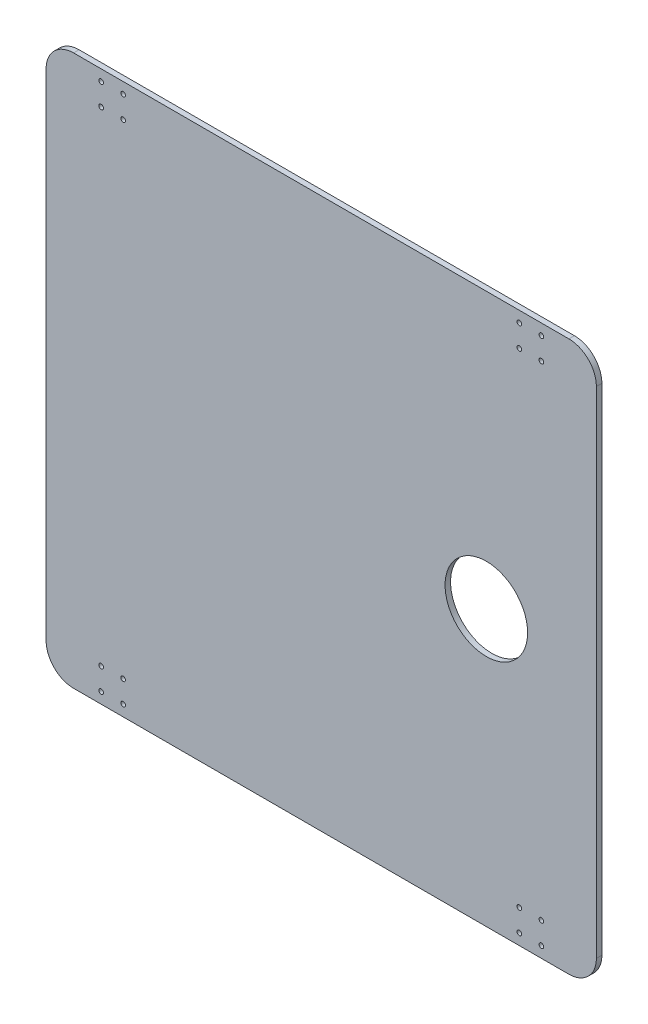
ISO-10303-21;
HEADER;
FILE_DESCRIPTION(('STEP AP214'),'2;1');
FILE_NAME('part.step','',(''),(''),'','','');
FILE_SCHEMA(('AUTOMOTIVE_DESIGN { 1 0 10303 214 1 1 1 1 }'));
ENDSEC;
DATA;
#1=APPLICATION_CONTEXT('core data for automotive mechanical design processes');
#2=APPLICATION_PROTOCOL_DEFINITION('international standard','automotive_design',2000,#1);
#3=PRODUCT_CONTEXT('',#1,'mechanical');
#4=PRODUCT('Part','Part','',(#3));
#5=PRODUCT_RELATED_PRODUCT_CATEGORY('part','',(#4));
#6=PRODUCT_DEFINITION_FORMATION('','',#4);
#7=PRODUCT_DEFINITION_CONTEXT('part definition',#1,'design');
#8=PRODUCT_DEFINITION('design','',#6,#7);
#9=PRODUCT_DEFINITION_SHAPE('','',#8);
#10=(LENGTH_UNIT() NAMED_UNIT(*) SI_UNIT(.MILLI.,.METRE.));
#11=(NAMED_UNIT(*) PLANE_ANGLE_UNIT() SI_UNIT($,.RADIAN.));
#12=(NAMED_UNIT(*) SI_UNIT($,.STERADIAN.) SOLID_ANGLE_UNIT());
#13=UNCERTAINTY_MEASURE_WITH_UNIT(LENGTH_MEASURE(1.E-05),#10,'distance_accuracy_value','');
#14=(GEOMETRIC_REPRESENTATION_CONTEXT(3) GLOBAL_UNCERTAINTY_ASSIGNED_CONTEXT((#13)) GLOBAL_UNIT_ASSIGNED_CONTEXT((#10,
#11,#12)) REPRESENTATION_CONTEXT('',''));
#15=CARTESIAN_POINT('',(0.,0.,0.));
#16=DIRECTION('',(0.,0.,1.));
#17=DIRECTION('',(1.,0.,0.));
#18=AXIS2_PLACEMENT_3D('',#15,#16,#17);
#19=CARTESIAN_POINT('',(0.,0.,10.));
#20=DIRECTION('',(0.,0.,1.));
#21=DIRECTION('',(1.,0.,0.));
#22=AXIS2_PLACEMENT_3D('',#19,#20,#21);
#23=PLANE('',#22);
#24=CARTESIAN_POINT('',(860.,-940.,10.));
#25=DIRECTION('',(0.,0.,1.));
#26=DIRECTION('',(-1.,0.,0.));
#27=AXIS2_PLACEMENT_3D('',#24,#25,#26);
#28=CIRCLE('',#27,4.25000000000002);
#29=CARTESIAN_POINT('',(855.75,-940.,10.));
#30=VERTEX_POINT('',#29);
#31=EDGE_CURVE('E266',#30,#30,#28,.T.);
#32=ORIENTED_EDGE('',*,*,#31,.F.);
#33=EDGE_LOOP('',(#32));
#34=FACE_BOUND('',#33,.T.);
#35=CARTESIAN_POINT('',(860.,-980.,10.));
#36=DIRECTION('',(0.,0.,1.));
#37=DIRECTION('',(-1.,0.,0.));
#38=AXIS2_PLACEMENT_3D('',#35,#36,#37);
#39=CIRCLE('',#38,4.24999999999999);
#40=CARTESIAN_POINT('',(855.75,-980.,10.));
#41=VERTEX_POINT('',#40);
#42=EDGE_CURVE('E254',#41,#41,#39,.T.);
#43=ORIENTED_EDGE('',*,*,#42,.F.);
#44=EDGE_LOOP('',(#43));
#45=FACE_BOUND('',#44,.T.);
#46=CARTESIAN_POINT('',(100.,-940.,10.));
#47=DIRECTION('',(0.,0.,1.));
#48=DIRECTION('',(1.,0.,0.));
#49=AXIS2_PLACEMENT_3D('',#46,#47,#48);
#50=CIRCLE('',#49,4.24999999999999);
#51=CARTESIAN_POINT('',(104.25,-940.,10.));
#52=VERTEX_POINT('',#51);
#53=EDGE_CURVE('E242',#52,#52,#50,.T.);
#54=ORIENTED_EDGE('',*,*,#53,.F.);
#55=EDGE_LOOP('',(#54));
#56=FACE_BOUND('',#55,.T.);
#57=CARTESIAN_POINT('',(100.,-980.,10.));
#58=DIRECTION('',(0.,0.,1.));
#59=DIRECTION('',(1.,0.,0.));
#60=AXIS2_PLACEMENT_3D('',#57,#58,#59);
#61=CIRCLE('',#60,4.24999999999999);
#62=CARTESIAN_POINT('',(104.25,-980.,10.));
#63=VERTEX_POINT('',#62);
#64=EDGE_CURVE('E230',#63,#63,#61,.T.);
#65=ORIENTED_EDGE('',*,*,#64,.F.);
#66=EDGE_LOOP('',(#65));
#67=FACE_BOUND('',#66,.T.);
#68=CARTESIAN_POINT('',(140.,-60.0000000000001,10.));
#69=DIRECTION('',(0.,0.,1.));
#70=DIRECTION('',(-1.,0.,0.));
#71=AXIS2_PLACEMENT_3D('',#68,#69,#70);
#72=CIRCLE('',#71,4.25);
#73=CARTESIAN_POINT('',(135.75,-60.0000000000001,10.));
#74=VERTEX_POINT('',#73);
#75=EDGE_CURVE('E218',#74,#74,#72,.T.);
#76=ORIENTED_EDGE('',*,*,#75,.F.);
#77=EDGE_LOOP('',(#76));
#78=FACE_BOUND('',#77,.T.);
#79=CARTESIAN_POINT('',(140.,-20.0000000000001,10.));
#80=DIRECTION('',(0.,0.,1.));
#81=DIRECTION('',(-1.,0.,0.));
#82=AXIS2_PLACEMENT_3D('',#79,#80,#81);
#83=CIRCLE('',#82,4.25);
#84=CARTESIAN_POINT('',(135.75,-20.0000000000001,10.));
#85=VERTEX_POINT('',#84);
#86=EDGE_CURVE('E206',#85,#85,#83,.T.);
#87=ORIENTED_EDGE('',*,*,#86,.F.);
#88=EDGE_LOOP('',(#87));
#89=FACE_BOUND('',#88,.T.);
#90=CARTESIAN_POINT('',(860.,-20.,10.));
#91=DIRECTION('',(0.,0.,1.));
#92=DIRECTION('',(1.,0.,0.));
#93=AXIS2_PLACEMENT_3D('',#90,#91,#92);
#94=CIRCLE('',#93,4.25);
#95=CARTESIAN_POINT('',(864.25,-20.,10.));
#96=VERTEX_POINT('',#95);
#97=EDGE_CURVE('E194',#96,#96,#94,.T.);
#98=ORIENTED_EDGE('',*,*,#97,.F.);
#99=EDGE_LOOP('',(#98));
#100=FACE_BOUND('',#99,.T.);
#101=CARTESIAN_POINT('',(900.,-20.,10.));
#102=DIRECTION('',(0.,0.,1.));
#103=DIRECTION('',(1.,0.,0.));
#104=AXIS2_PLACEMENT_3D('',#101,#102,#103);
#105=CIRCLE('',#104,4.25);
#106=CARTESIAN_POINT('',(904.25,-20.,10.));
#107=VERTEX_POINT('',#106);
#108=EDGE_CURVE('E182',#107,#107,#105,.T.);
#109=ORIENTED_EDGE('',*,*,#108,.F.);
#110=EDGE_LOOP('',(#109));
#111=FACE_BOUND('',#110,.T.);
#112=DIRECTION('',(0.,-1.,0.));
#113=VECTOR('',#112,1.);
#114=CARTESIAN_POINT('',(0.,0.,10.));
#115=LINE('',#114,#113);
#116=CARTESIAN_POINT('',(0.,-50.,10.));
#117=VERTEX_POINT('',#116);
#118=CARTESIAN_POINT('',(1.16341445918999E-13,-950.,10.));
#119=VERTEX_POINT('',#118);
#120=EDGE_CURVE('E139',#117,#119,#115,.T.);
#121=ORIENTED_EDGE('',*,*,#120,.T.);
#122=CARTESIAN_POINT('',(50.0000000000001,-950.,10.));
#123=DIRECTION('',(0.,0.,1.));
#124=DIRECTION('',(1.,0.,0.));
#125=AXIS2_PLACEMENT_3D('',#122,#123,#124);
#126=CIRCLE('',#125,50.);
#127=CARTESIAN_POINT('',(50.0000000000001,-1000.,10.));
#128=VERTEX_POINT('',#127);
#129=EDGE_CURVE('E154',#119,#128,#126,.T.);
#130=ORIENTED_EDGE('',*,*,#129,.T.);
#131=DIRECTION('',(1.,0.,0.));
#132=VECTOR('',#131,1.);
#133=CARTESIAN_POINT('',(1.22464679914735E-13,-1000.,10.));
#134=LINE('',#133,#132);
#135=CARTESIAN_POINT('',(950.,-1000.,10.));
#136=VERTEX_POINT('',#135);
#137=EDGE_CURVE('E121',#128,#136,#134,.T.);
#138=ORIENTED_EDGE('',*,*,#137,.T.);
#139=CARTESIAN_POINT('',(950.,-950.,10.));
#140=DIRECTION('',(0.,0.,1.));
#141=DIRECTION('',(1.,0.,0.));
#142=AXIS2_PLACEMENT_3D('',#139,#140,#141);
#143=CIRCLE('',#142,50.);
#144=CARTESIAN_POINT('',(1000.,-950.,10.));
#145=VERTEX_POINT('',#144);
#146=EDGE_CURVE('E152',#136,#145,#143,.T.);
#147=ORIENTED_EDGE('',*,*,#146,.T.);
#148=DIRECTION('',(0.,1.,0.));
#149=VECTOR('',#148,1.);
#150=CARTESIAN_POINT('',(1000.,0.,10.));
#151=LINE('',#150,#149);
#152=CARTESIAN_POINT('',(1000.,-50.,10.));
#153=VERTEX_POINT('',#152);
#154=EDGE_CURVE('E165',#145,#153,#151,.T.);
#155=ORIENTED_EDGE('',*,*,#154,.T.);
#156=CARTESIAN_POINT('',(950.,-50.,10.));
#157=DIRECTION('',(0.,0.,1.));
#158=DIRECTION('',(1.,0.,0.));
#159=AXIS2_PLACEMENT_3D('',#156,#157,#158);
#160=CIRCLE('',#159,50.);
#161=CARTESIAN_POINT('',(950.,0.,10.));
#162=VERTEX_POINT('',#161);
#163=EDGE_CURVE('E56',#153,#162,#160,.T.);
#164=ORIENTED_EDGE('',*,*,#163,.T.);
#165=DIRECTION('',(-1.,0.,0.));
#166=VECTOR('',#165,1.);
#167=CARTESIAN_POINT('',(0.,0.,10.));
#168=LINE('',#167,#166);
#169=CARTESIAN_POINT('',(50.,0.,10.));
#170=VERTEX_POINT('',#169);
#171=EDGE_CURVE('E140',#162,#170,#168,.T.);
#172=ORIENTED_EDGE('',*,*,#171,.T.);
#173=CARTESIAN_POINT('',(50.,-50.,10.));
#174=DIRECTION('',(0.,0.,1.));
#175=DIRECTION('',(1.,0.,0.));
#176=AXIS2_PLACEMENT_3D('',#173,#174,#175);
#177=CIRCLE('',#176,50.);
#178=EDGE_CURVE('E149',#170,#117,#177,.T.);
#179=ORIENTED_EDGE('',*,*,#178,.T.);
#180=EDGE_LOOP('',(#121,#130,#138,#147,#155,#164,#172,#179));
#181=FACE_BOUND('',#180,.T.);
#182=CARTESIAN_POINT('',(800.,-500.,10.));
#183=DIRECTION('',(0.,0.,1.));
#184=DIRECTION('',(1.,0.,0.));
#185=AXIS2_PLACEMENT_3D('',#182,#183,#184);
#186=CIRCLE('',#185,75.);
#187=CARTESIAN_POINT('',(875.,-500.,10.));
#188=VERTEX_POINT('',#187);
#189=EDGE_CURVE('E134',#188,#188,#186,.T.);
#190=ORIENTED_EDGE('',*,*,#189,.F.);
#191=EDGE_LOOP('',(#190));
#192=FACE_BOUND('',#191,.T.);
#193=CARTESIAN_POINT('',(900.,-60.,10.));
#194=DIRECTION('',(0.,0.,1.));
#195=DIRECTION('',(1.,0.,0.));
#196=AXIS2_PLACEMENT_3D('',#193,#194,#195);
#197=CIRCLE('',#196,4.25);
#198=CARTESIAN_POINT('',(904.25,-60.,10.));
#199=VERTEX_POINT('',#198);
#200=EDGE_CURVE('E188',#199,#199,#197,.T.);
#201=ORIENTED_EDGE('',*,*,#200,.F.);
#202=EDGE_LOOP('',(#201));
#203=FACE_BOUND('',#202,.T.);
#204=CARTESIAN_POINT('',(860.,-60.,10.));
#205=DIRECTION('',(0.,0.,1.));
#206=DIRECTION('',(1.,0.,0.));
#207=AXIS2_PLACEMENT_3D('',#204,#205,#206);
#208=CIRCLE('',#207,4.25);
#209=CARTESIAN_POINT('',(864.25,-60.,10.));
#210=VERTEX_POINT('',#209);
#211=EDGE_CURVE('E200',#210,#210,#208,.T.);
#212=ORIENTED_EDGE('',*,*,#211,.F.);
#213=EDGE_LOOP('',(#212));
#214=FACE_BOUND('',#213,.T.);
#215=CARTESIAN_POINT('',(100.,-20.0000000000001,10.));
#216=DIRECTION('',(0.,0.,1.));
#217=DIRECTION('',(-1.,0.,0.));
#218=AXIS2_PLACEMENT_3D('',#215,#216,#217);
#219=CIRCLE('',#218,4.25);
#220=CARTESIAN_POINT('',(95.7500000000001,-20.0000000000001,10.));
#221=VERTEX_POINT('',#220);
#222=EDGE_CURVE('E212',#221,#221,#219,.T.);
#223=ORIENTED_EDGE('',*,*,#222,.F.);
#224=EDGE_LOOP('',(#223));
#225=FACE_BOUND('',#224,.T.);
#226=CARTESIAN_POINT('',(100.,-60.0000000000001,10.));
#227=DIRECTION('',(0.,0.,1.));
#228=DIRECTION('',(-1.,0.,0.));
#229=AXIS2_PLACEMENT_3D('',#226,#227,#228);
#230=CIRCLE('',#229,4.25);
#231=CARTESIAN_POINT('',(95.7500000000002,-60.0000000000001,10.));
#232=VERTEX_POINT('',#231);
#233=EDGE_CURVE('E224',#232,#232,#230,.T.);
#234=ORIENTED_EDGE('',*,*,#233,.F.);
#235=EDGE_LOOP('',(#234));
#236=FACE_BOUND('',#235,.T.);
#237=CARTESIAN_POINT('',(140.,-980.,10.));
#238=DIRECTION('',(0.,0.,1.));
#239=DIRECTION('',(1.,0.,0.));
#240=AXIS2_PLACEMENT_3D('',#237,#238,#239);
#241=CIRCLE('',#240,4.24999999999999);
#242=CARTESIAN_POINT('',(144.25,-980.,10.));
#243=VERTEX_POINT('',#242);
#244=EDGE_CURVE('E236',#243,#243,#241,.T.);
#245=ORIENTED_EDGE('',*,*,#244,.F.);
#246=EDGE_LOOP('',(#245));
#247=FACE_BOUND('',#246,.T.);
#248=CARTESIAN_POINT('',(140.,-940.,10.));
#249=DIRECTION('',(0.,0.,1.));
#250=DIRECTION('',(1.,0.,0.));
#251=AXIS2_PLACEMENT_3D('',#248,#249,#250);
#252=CIRCLE('',#251,4.24999999999999);
#253=CARTESIAN_POINT('',(144.25,-940.,10.));
#254=VERTEX_POINT('',#253);
#255=EDGE_CURVE('E248',#254,#254,#252,.T.);
#256=ORIENTED_EDGE('',*,*,#255,.F.);
#257=EDGE_LOOP('',(#256));
#258=FACE_BOUND('',#257,.T.);
#259=CARTESIAN_POINT('',(900.,-980.,10.));
#260=DIRECTION('',(0.,0.,1.));
#261=DIRECTION('',(-1.,0.,0.));
#262=AXIS2_PLACEMENT_3D('',#259,#260,#261);
#263=CIRCLE('',#262,4.24999999999999);
#264=CARTESIAN_POINT('',(895.75,-980.,10.));
#265=VERTEX_POINT('',#264);
#266=EDGE_CURVE('E260',#265,#265,#263,.T.);
#267=ORIENTED_EDGE('',*,*,#266,.F.);
#268=EDGE_LOOP('',(#267));
#269=FACE_BOUND('',#268,.T.);
#270=CARTESIAN_POINT('',(900.,-940.,10.));
#271=DIRECTION('',(0.,0.,1.));
#272=DIRECTION('',(-1.,0.,0.));
#273=AXIS2_PLACEMENT_3D('',#270,#271,#272);
#274=CIRCLE('',#273,4.25000000000002);
#275=CARTESIAN_POINT('',(895.75,-940.,10.));
#276=VERTEX_POINT('',#275);
#277=EDGE_CURVE('E272',#276,#276,#274,.T.);
#278=ORIENTED_EDGE('',*,*,#277,.F.);
#279=EDGE_LOOP('',(#278));
#280=FACE_BOUND('',#279,.T.);
#281=ADVANCED_FACE('F35',(#34,#45,#56,#67,#78,#89,#100,#111,#181,#192,#203,#214,#225,#236,#247,
#258,#269,#280),#23,.T.);
#282=CARTESIAN_POINT('',(0.,0.,0.));
#283=DIRECTION('',(0.,0.,1.));
#284=DIRECTION('',(1.,0.,0.));
#285=AXIS2_PLACEMENT_3D('',#282,#283,#284);
#286=PLANE('',#285);
#287=DIRECTION('',(1.,0.,0.));
#288=VECTOR('',#287,1.);
#289=CARTESIAN_POINT('',(1.22464679914735E-13,-1000.,0.));
#290=LINE('',#289,#288);
#291=CARTESIAN_POINT('',(50.0000000000001,-1000.,0.));
#292=VERTEX_POINT('',#291);
#293=CARTESIAN_POINT('',(950.,-1000.,0.));
#294=VERTEX_POINT('',#293);
#295=EDGE_CURVE('E118',#292,#294,#290,.T.);
#296=ORIENTED_EDGE('',*,*,#295,.F.);
#297=CARTESIAN_POINT('',(50.0000000000001,-950.,0.));
#298=DIRECTION('',(0.,0.,1.));
#299=DIRECTION('',(1.,0.,0.));
#300=AXIS2_PLACEMENT_3D('',#297,#298,#299);
#301=CIRCLE('',#300,50.);
#302=CARTESIAN_POINT('',(1.16341445918999E-13,-950.,0.));
#303=VERTEX_POINT('',#302);
#304=EDGE_CURVE('E101',#292,#303,#301,.F.);
#305=ORIENTED_EDGE('',*,*,#304,.T.);
#306=DIRECTION('',(0.,-1.,0.));
#307=VECTOR('',#306,1.);
#308=CARTESIAN_POINT('',(0.,0.,0.));
#309=LINE('',#308,#307);
#310=CARTESIAN_POINT('',(0.,-50.,0.));
#311=VERTEX_POINT('',#310);
#312=EDGE_CURVE('E129',#311,#303,#309,.T.);
#313=ORIENTED_EDGE('',*,*,#312,.F.);
#314=CARTESIAN_POINT('',(50.,-50.,0.));
#315=DIRECTION('',(0.,0.,1.));
#316=DIRECTION('',(1.,0.,0.));
#317=AXIS2_PLACEMENT_3D('',#314,#315,#316);
#318=CIRCLE('',#317,50.);
#319=CARTESIAN_POINT('',(50.,0.,0.));
#320=VERTEX_POINT('',#319);
#321=EDGE_CURVE('E122',#311,#320,#318,.F.);
#322=ORIENTED_EDGE('',*,*,#321,.T.);
#323=DIRECTION('',(-1.,0.,0.));
#324=VECTOR('',#323,1.);
#325=CARTESIAN_POINT('',(0.,0.,0.));
#326=LINE('',#325,#324);
#327=CARTESIAN_POINT('',(950.,0.,0.));
#328=VERTEX_POINT('',#327);
#329=EDGE_CURVE('E132',#328,#320,#326,.T.);
#330=ORIENTED_EDGE('',*,*,#329,.F.);
#331=CARTESIAN_POINT('',(950.,-50.,0.));
#332=DIRECTION('',(0.,0.,1.));
#333=DIRECTION('',(1.,0.,0.));
#334=AXIS2_PLACEMENT_3D('',#331,#332,#333);
#335=CIRCLE('',#334,50.);
#336=CARTESIAN_POINT('',(1000.,-50.,0.));
#337=VERTEX_POINT('',#336);
#338=EDGE_CURVE('E143',#328,#337,#335,.F.);
#339=ORIENTED_EDGE('',*,*,#338,.T.);
#340=DIRECTION('',(0.,1.,0.));
#341=VECTOR('',#340,1.);
#342=CARTESIAN_POINT('',(1000.,0.,0.));
#343=LINE('',#342,#341);
#344=CARTESIAN_POINT('',(1000.,-950.,0.));
#345=VERTEX_POINT('',#344);
#346=EDGE_CURVE('E128',#345,#337,#343,.T.);
#347=ORIENTED_EDGE('',*,*,#346,.F.);
#348=CARTESIAN_POINT('',(950.,-950.,0.));
#349=DIRECTION('',(0.,0.,1.));
#350=DIRECTION('',(1.,0.,0.));
#351=AXIS2_PLACEMENT_3D('',#348,#349,#350);
#352=CIRCLE('',#351,50.);
#353=EDGE_CURVE('E112',#345,#294,#352,.F.);
#354=ORIENTED_EDGE('',*,*,#353,.T.);
#355=EDGE_LOOP('',(#296,#305,#313,#322,#330,#339,#347,#354));
#356=FACE_BOUND('',#355,.T.);
#357=CARTESIAN_POINT('',(800.,-500.,0.));
#358=DIRECTION('',(0.,0.,1.));
#359=DIRECTION('',(1.,0.,0.));
#360=AXIS2_PLACEMENT_3D('',#357,#358,#359);
#361=CIRCLE('',#360,75.);
#362=CARTESIAN_POINT('',(875.,-500.,0.));
#363=VERTEX_POINT('',#362);
#364=EDGE_CURVE('E179',#363,#363,#361,.T.);
#365=ORIENTED_EDGE('',*,*,#364,.T.);
#366=EDGE_LOOP('',(#365));
#367=FACE_BOUND('',#366,.T.);
#368=CARTESIAN_POINT('',(900.,-20.,0.));
#369=DIRECTION('',(0.,0.,1.));
#370=DIRECTION('',(1.,0.,0.));
#371=AXIS2_PLACEMENT_3D('',#368,#369,#370);
#372=CIRCLE('',#371,4.25);
#373=CARTESIAN_POINT('',(904.25,-20.,0.));
#374=VERTEX_POINT('',#373);
#375=EDGE_CURVE('E185',#374,#374,#372,.T.);
#376=ORIENTED_EDGE('',*,*,#375,.T.);
#377=EDGE_LOOP('',(#376));
#378=FACE_BOUND('',#377,.T.);
#379=CARTESIAN_POINT('',(900.,-60.,0.));
#380=DIRECTION('',(0.,0.,1.));
#381=DIRECTION('',(1.,0.,0.));
#382=AXIS2_PLACEMENT_3D('',#379,#380,#381);
#383=CIRCLE('',#382,4.25);
#384=CARTESIAN_POINT('',(904.25,-60.,0.));
#385=VERTEX_POINT('',#384);
#386=EDGE_CURVE('E191',#385,#385,#383,.T.);
#387=ORIENTED_EDGE('',*,*,#386,.T.);
#388=EDGE_LOOP('',(#387));
#389=FACE_BOUND('',#388,.T.);
#390=CARTESIAN_POINT('',(860.,-20.,0.));
#391=DIRECTION('',(0.,0.,1.));
#392=DIRECTION('',(1.,0.,0.));
#393=AXIS2_PLACEMENT_3D('',#390,#391,#392);
#394=CIRCLE('',#393,4.25);
#395=CARTESIAN_POINT('',(864.25,-20.,0.));
#396=VERTEX_POINT('',#395);
#397=EDGE_CURVE('E197',#396,#396,#394,.T.);
#398=ORIENTED_EDGE('',*,*,#397,.T.);
#399=EDGE_LOOP('',(#398));
#400=FACE_BOUND('',#399,.T.);
#401=CARTESIAN_POINT('',(860.,-60.,0.));
#402=DIRECTION('',(0.,0.,1.));
#403=DIRECTION('',(1.,0.,0.));
#404=AXIS2_PLACEMENT_3D('',#401,#402,#403);
#405=CIRCLE('',#404,4.25);
#406=CARTESIAN_POINT('',(864.25,-60.,0.));
#407=VERTEX_POINT('',#406);
#408=EDGE_CURVE('E203',#407,#407,#405,.T.);
#409=ORIENTED_EDGE('',*,*,#408,.T.);
#410=EDGE_LOOP('',(#409));
#411=FACE_BOUND('',#410,.T.);
#412=CARTESIAN_POINT('',(140.,-20.0000000000001,0.));
#413=DIRECTION('',(0.,0.,1.));
#414=DIRECTION('',(-1.,0.,0.));
#415=AXIS2_PLACEMENT_3D('',#412,#413,#414);
#416=CIRCLE('',#415,4.25);
#417=CARTESIAN_POINT('',(135.75,-20.0000000000001,0.));
#418=VERTEX_POINT('',#417);
#419=EDGE_CURVE('E209',#418,#418,#416,.T.);
#420=ORIENTED_EDGE('',*,*,#419,.T.);
#421=EDGE_LOOP('',(#420));
#422=FACE_BOUND('',#421,.T.);
#423=CARTESIAN_POINT('',(100.,-20.0000000000001,0.));
#424=DIRECTION('',(0.,0.,1.));
#425=DIRECTION('',(-1.,0.,0.));
#426=AXIS2_PLACEMENT_3D('',#423,#424,#425);
#427=CIRCLE('',#426,4.25);
#428=CARTESIAN_POINT('',(95.7500000000001,-20.0000000000001,0.));
#429=VERTEX_POINT('',#428);
#430=EDGE_CURVE('E215',#429,#429,#427,.T.);
#431=ORIENTED_EDGE('',*,*,#430,.T.);
#432=EDGE_LOOP('',(#431));
#433=FACE_BOUND('',#432,.T.);
#434=CARTESIAN_POINT('',(140.,-60.0000000000001,0.));
#435=DIRECTION('',(0.,0.,1.));
#436=DIRECTION('',(-1.,0.,0.));
#437=AXIS2_PLACEMENT_3D('',#434,#435,#436);
#438=CIRCLE('',#437,4.25);
#439=CARTESIAN_POINT('',(135.75,-60.0000000000001,0.));
#440=VERTEX_POINT('',#439);
#441=EDGE_CURVE('E221',#440,#440,#438,.T.);
#442=ORIENTED_EDGE('',*,*,#441,.T.);
#443=EDGE_LOOP('',(#442));
#444=FACE_BOUND('',#443,.T.);
#445=CARTESIAN_POINT('',(100.,-60.0000000000001,0.));
#446=DIRECTION('',(0.,0.,1.));
#447=DIRECTION('',(-1.,0.,0.));
#448=AXIS2_PLACEMENT_3D('',#445,#446,#447);
#449=CIRCLE('',#448,4.25);
#450=CARTESIAN_POINT('',(95.7500000000002,-60.0000000000001,0.));
#451=VERTEX_POINT('',#450);
#452=EDGE_CURVE('E227',#451,#451,#449,.T.);
#453=ORIENTED_EDGE('',*,*,#452,.T.);
#454=EDGE_LOOP('',(#453));
#455=FACE_BOUND('',#454,.T.);
#456=CARTESIAN_POINT('',(100.,-980.,0.));
#457=DIRECTION('',(0.,0.,1.));
#458=DIRECTION('',(1.,0.,0.));
#459=AXIS2_PLACEMENT_3D('',#456,#457,#458);
#460=CIRCLE('',#459,4.24999999999999);
#461=CARTESIAN_POINT('',(104.25,-980.,0.));
#462=VERTEX_POINT('',#461);
#463=EDGE_CURVE('E233',#462,#462,#460,.T.);
#464=ORIENTED_EDGE('',*,*,#463,.T.);
#465=EDGE_LOOP('',(#464));
#466=FACE_BOUND('',#465,.T.);
#467=CARTESIAN_POINT('',(140.,-980.,0.));
#468=DIRECTION('',(0.,0.,1.));
#469=DIRECTION('',(1.,0.,0.));
#470=AXIS2_PLACEMENT_3D('',#467,#468,#469);
#471=CIRCLE('',#470,4.24999999999999);
#472=CARTESIAN_POINT('',(144.25,-980.,0.));
#473=VERTEX_POINT('',#472);
#474=EDGE_CURVE('E239',#473,#473,#471,.T.);
#475=ORIENTED_EDGE('',*,*,#474,.T.);
#476=EDGE_LOOP('',(#475));
#477=FACE_BOUND('',#476,.T.);
#478=CARTESIAN_POINT('',(100.,-940.,0.));
#479=DIRECTION('',(0.,0.,1.));
#480=DIRECTION('',(1.,0.,0.));
#481=AXIS2_PLACEMENT_3D('',#478,#479,#480);
#482=CIRCLE('',#481,4.24999999999999);
#483=CARTESIAN_POINT('',(104.25,-940.,0.));
#484=VERTEX_POINT('',#483);
#485=EDGE_CURVE('E245',#484,#484,#482,.T.);
#486=ORIENTED_EDGE('',*,*,#485,.T.);
#487=EDGE_LOOP('',(#486));
#488=FACE_BOUND('',#487,.T.);
#489=CARTESIAN_POINT('',(140.,-940.,0.));
#490=DIRECTION('',(0.,0.,1.));
#491=DIRECTION('',(1.,0.,0.));
#492=AXIS2_PLACEMENT_3D('',#489,#490,#491);
#493=CIRCLE('',#492,4.24999999999999);
#494=CARTESIAN_POINT('',(144.25,-940.,0.));
#495=VERTEX_POINT('',#494);
#496=EDGE_CURVE('E251',#495,#495,#493,.T.);
#497=ORIENTED_EDGE('',*,*,#496,.T.);
#498=EDGE_LOOP('',(#497));
#499=FACE_BOUND('',#498,.T.);
#500=CARTESIAN_POINT('',(860.,-980.,0.));
#501=DIRECTION('',(0.,0.,1.));
#502=DIRECTION('',(-1.,0.,0.));
#503=AXIS2_PLACEMENT_3D('',#500,#501,#502);
#504=CIRCLE('',#503,4.24999999999999);
#505=CARTESIAN_POINT('',(855.75,-980.,0.));
#506=VERTEX_POINT('',#505);
#507=EDGE_CURVE('E257',#506,#506,#504,.T.);
#508=ORIENTED_EDGE('',*,*,#507,.T.);
#509=EDGE_LOOP('',(#508));
#510=FACE_BOUND('',#509,.T.);
#511=CARTESIAN_POINT('',(900.,-980.,0.));
#512=DIRECTION('',(0.,0.,1.));
#513=DIRECTION('',(-1.,0.,0.));
#514=AXIS2_PLACEMENT_3D('',#511,#512,#513);
#515=CIRCLE('',#514,4.24999999999999);
#516=CARTESIAN_POINT('',(895.75,-980.,0.));
#517=VERTEX_POINT('',#516);
#518=EDGE_CURVE('E263',#517,#517,#515,.T.);
#519=ORIENTED_EDGE('',*,*,#518,.T.);
#520=EDGE_LOOP('',(#519));
#521=FACE_BOUND('',#520,.T.);
#522=CARTESIAN_POINT('',(860.,-940.,0.));
#523=DIRECTION('',(0.,0.,1.));
#524=DIRECTION('',(-1.,0.,0.));
#525=AXIS2_PLACEMENT_3D('',#522,#523,#524);
#526=CIRCLE('',#525,4.25000000000002);
#527=CARTESIAN_POINT('',(855.75,-940.,0.));
#528=VERTEX_POINT('',#527);
#529=EDGE_CURVE('E269',#528,#528,#526,.T.);
#530=ORIENTED_EDGE('',*,*,#529,.T.);
#531=EDGE_LOOP('',(#530));
#532=FACE_BOUND('',#531,.T.);
#533=CARTESIAN_POINT('',(900.,-940.,0.));
#534=DIRECTION('',(0.,0.,1.));
#535=DIRECTION('',(-1.,0.,0.));
#536=AXIS2_PLACEMENT_3D('',#533,#534,#535);
#537=CIRCLE('',#536,4.25000000000002);
#538=CARTESIAN_POINT('',(895.75,-940.,0.));
#539=VERTEX_POINT('',#538);
#540=EDGE_CURVE('E275',#539,#539,#537,.T.);
#541=ORIENTED_EDGE('',*,*,#540,.T.);
#542=EDGE_LOOP('',(#541));
#543=FACE_BOUND('',#542,.T.);
#544=ADVANCED_FACE('F125',(#356,#367,#378,#389,#400,#411,#422,#433,#444,#455,#466,#477,#488,
#499,#510,#521,#532,#543),#286,.F.);
#545=CARTESIAN_POINT('',(0.,0.,10.));
#546=DIRECTION('',(1.,0.,0.));
#547=DIRECTION('',(0.,1.,0.));
#548=AXIS2_PLACEMENT_3D('',#545,#546,#547);
#549=PLANE('',#548);
#550=ORIENTED_EDGE('',*,*,#312,.T.);
#551=DIRECTION('',(0.,0.,-1.));
#552=VECTOR('',#551,1.);
#553=CARTESIAN_POINT('',(1.16341445918999E-13,-950.,10.));
#554=LINE('',#553,#552);
#555=EDGE_CURVE('E106',#303,#119,#554,.F.);
#556=ORIENTED_EDGE('',*,*,#555,.T.);
#557=ORIENTED_EDGE('',*,*,#120,.F.);
#558=DIRECTION('',(0.,0.,-1.));
#559=VECTOR('',#558,1.);
#560=CARTESIAN_POINT('',(0.,-50.,10.));
#561=LINE('',#560,#559);
#562=EDGE_CURVE('E111',#117,#311,#561,.T.);
#563=ORIENTED_EDGE('',*,*,#562,.T.);
#564=EDGE_LOOP('',(#550,#556,#557,#563));
#565=FACE_BOUND('',#564,.T.);
#566=ADVANCED_FACE('F290',(#565),#549,.F.);
#567=CARTESIAN_POINT('',(1.22464679914735E-13,-1000.,10.));
#568=DIRECTION('',(0.,1.,0.));
#569=DIRECTION('',(0.,0.,1.));
#570=AXIS2_PLACEMENT_3D('',#567,#568,#569);
#571=PLANE('',#570);
#572=ORIENTED_EDGE('',*,*,#137,.F.);
#573=DIRECTION('',(0.,0.,-1.));
#574=VECTOR('',#573,1.);
#575=CARTESIAN_POINT('',(50.0000000000001,-1000.,10.));
#576=LINE('',#575,#574);
#577=EDGE_CURVE('E105',#128,#292,#576,.T.);
#578=ORIENTED_EDGE('',*,*,#577,.T.);
#579=ORIENTED_EDGE('',*,*,#295,.T.);
#580=DIRECTION('',(0.,0.,-1.));
#581=VECTOR('',#580,1.);
#582=CARTESIAN_POINT('',(950.,-1000.,10.));
#583=LINE('',#582,#581);
#584=EDGE_CURVE('E123',#294,#136,#583,.F.);
#585=ORIENTED_EDGE('',*,*,#584,.T.);
#586=EDGE_LOOP('',(#572,#578,#579,#585));
#587=FACE_BOUND('',#586,.T.);
#588=ADVANCED_FACE('F117',(#587),#571,.F.);
#589=CARTESIAN_POINT('',(1000.,0.,10.));
#590=DIRECTION('',(-1.,0.,0.));
#591=DIRECTION('',(0.,-1.,0.));
#592=AXIS2_PLACEMENT_3D('',#589,#590,#591);
#593=PLANE('',#592);
#594=ORIENTED_EDGE('',*,*,#154,.F.);
#595=DIRECTION('',(0.,0.,-1.));
#596=VECTOR('',#595,1.);
#597=CARTESIAN_POINT('',(1000.,-950.,10.));
#598=LINE('',#597,#596);
#599=EDGE_CURVE('E158',#145,#345,#598,.T.);
#600=ORIENTED_EDGE('',*,*,#599,.T.);
#601=ORIENTED_EDGE('',*,*,#346,.T.);
#602=DIRECTION('',(0.,0.,-1.));
#603=VECTOR('',#602,1.);
#604=CARTESIAN_POINT('',(1000.,-50.,10.));
#605=LINE('',#604,#603);
#606=EDGE_CURVE('E156',#337,#153,#605,.F.);
#607=ORIENTED_EDGE('',*,*,#606,.T.);
#608=EDGE_LOOP('',(#594,#600,#601,#607));
#609=FACE_BOUND('',#608,.T.);
#610=ADVANCED_FACE('F163',(#609),#593,.F.);
#611=CARTESIAN_POINT('',(0.,0.,10.));
#612=DIRECTION('',(0.,-1.,0.));
#613=DIRECTION('',(0.,0.,-1.));
#614=AXIS2_PLACEMENT_3D('',#611,#612,#613);
#615=PLANE('',#614);
#616=ORIENTED_EDGE('',*,*,#171,.F.);
#617=DIRECTION('',(0.,0.,-1.));
#618=VECTOR('',#617,1.);
#619=CARTESIAN_POINT('',(950.,0.,10.));
#620=LINE('',#619,#618);
#621=EDGE_CURVE('E11',#162,#328,#620,.T.);
#622=ORIENTED_EDGE('',*,*,#621,.T.);
#623=ORIENTED_EDGE('',*,*,#329,.T.);
#624=DIRECTION('',(0.,0.,-1.));
#625=VECTOR('',#624,1.);
#626=CARTESIAN_POINT('',(50.,0.,10.));
#627=LINE('',#626,#625);
#628=EDGE_CURVE('E43',#320,#170,#627,.F.);
#629=ORIENTED_EDGE('',*,*,#628,.T.);
#630=EDGE_LOOP('',(#616,#622,#623,#629));
#631=FACE_BOUND('',#630,.T.);
#632=ADVANCED_FACE('F172',(#631),#615,.F.);
#633=CARTESIAN_POINT('',(800.,-500.,10.));
#634=DIRECTION('',(0.,0.,-1.));
#635=DIRECTION('',(-1.,0.,0.));
#636=AXIS2_PLACEMENT_3D('',#633,#634,#635);
#637=CYLINDRICAL_SURFACE('',#636,75.);
#638=ORIENTED_EDGE('',*,*,#189,.T.);
#639=EDGE_LOOP('',(#638));
#640=FACE_BOUND('',#639,.T.);
#641=ORIENTED_EDGE('',*,*,#364,.F.);
#642=EDGE_LOOP('',(#641));
#643=FACE_BOUND('',#642,.T.);
#644=ADVANCED_FACE('F295',(#640,#643),#637,.F.);
#645=CARTESIAN_POINT('',(900.,-20.,10.));
#646=DIRECTION('',(0.,0.,-1.));
#647=DIRECTION('',(-1.,0.,0.));
#648=AXIS2_PLACEMENT_3D('',#645,#646,#647);
#649=CYLINDRICAL_SURFACE('',#648,4.25);
#650=ORIENTED_EDGE('',*,*,#108,.T.);
#651=EDGE_LOOP('',(#650));
#652=FACE_BOUND('',#651,.T.);
#653=ORIENTED_EDGE('',*,*,#375,.F.);
#654=EDGE_LOOP('',(#653));
#655=FACE_BOUND('',#654,.T.);
#656=ADVANCED_FACE('F402',(#652,#655),#649,.F.);
#657=CARTESIAN_POINT('',(900.,-60.,10.));
#658=DIRECTION('',(0.,0.,-1.));
#659=DIRECTION('',(-1.,0.,0.));
#660=AXIS2_PLACEMENT_3D('',#657,#658,#659);
#661=CYLINDRICAL_SURFACE('',#660,4.25);
#662=ORIENTED_EDGE('',*,*,#200,.T.);
#663=EDGE_LOOP('',(#662));
#664=FACE_BOUND('',#663,.T.);
#665=ORIENTED_EDGE('',*,*,#386,.F.);
#666=EDGE_LOOP('',(#665));
#667=FACE_BOUND('',#666,.T.);
#668=ADVANCED_FACE('F399',(#664,#667),#661,.F.);
#669=CARTESIAN_POINT('',(860.,-20.,10.));
#670=DIRECTION('',(0.,0.,-1.));
#671=DIRECTION('',(-1.,0.,0.));
#672=AXIS2_PLACEMENT_3D('',#669,#670,#671);
#673=CYLINDRICAL_SURFACE('',#672,4.25);
#674=ORIENTED_EDGE('',*,*,#97,.T.);
#675=EDGE_LOOP('',(#674));
#676=FACE_BOUND('',#675,.T.);
#677=ORIENTED_EDGE('',*,*,#397,.F.);
#678=EDGE_LOOP('',(#677));
#679=FACE_BOUND('',#678,.T.);
#680=ADVANCED_FACE('F395',(#676,#679),#673,.F.);
#681=CARTESIAN_POINT('',(860.,-60.,10.));
#682=DIRECTION('',(0.,0.,-1.));
#683=DIRECTION('',(-1.,0.,0.));
#684=AXIS2_PLACEMENT_3D('',#681,#682,#683);
#685=CYLINDRICAL_SURFACE('',#684,4.25);
#686=ORIENTED_EDGE('',*,*,#211,.T.);
#687=EDGE_LOOP('',(#686));
#688=FACE_BOUND('',#687,.T.);
#689=ORIENTED_EDGE('',*,*,#408,.F.);
#690=EDGE_LOOP('',(#689));
#691=FACE_BOUND('',#690,.T.);
#692=ADVANCED_FACE('F391',(#688,#691),#685,.F.);
#693=CARTESIAN_POINT('',(140.,-20.0000000000001,10.));
#694=DIRECTION('',(0.,0.,-1.));
#695=DIRECTION('',(-1.,0.,0.));
#696=AXIS2_PLACEMENT_3D('',#693,#694,#695);
#697=CYLINDRICAL_SURFACE('',#696,4.25);
#698=ORIENTED_EDGE('',*,*,#86,.T.);
#699=EDGE_LOOP('',(#698));
#700=FACE_BOUND('',#699,.T.);
#701=ORIENTED_EDGE('',*,*,#419,.F.);
#702=EDGE_LOOP('',(#701));
#703=FACE_BOUND('',#702,.T.);
#704=ADVANCED_FACE('F387',(#700,#703),#697,.F.);
#705=CARTESIAN_POINT('',(100.,-20.0000000000001,10.));
#706=DIRECTION('',(0.,0.,-1.));
#707=DIRECTION('',(-1.,0.,0.));
#708=AXIS2_PLACEMENT_3D('',#705,#706,#707);
#709=CYLINDRICAL_SURFACE('',#708,4.25);
#710=ORIENTED_EDGE('',*,*,#222,.T.);
#711=EDGE_LOOP('',(#710));
#712=FACE_BOUND('',#711,.T.);
#713=ORIENTED_EDGE('',*,*,#430,.F.);
#714=EDGE_LOOP('',(#713));
#715=FACE_BOUND('',#714,.T.);
#716=ADVANCED_FACE('F383',(#712,#715),#709,.F.);
#717=CARTESIAN_POINT('',(140.,-60.0000000000001,10.));
#718=DIRECTION('',(0.,0.,-1.));
#719=DIRECTION('',(-1.,0.,0.));
#720=AXIS2_PLACEMENT_3D('',#717,#718,#719);
#721=CYLINDRICAL_SURFACE('',#720,4.25);
#722=ORIENTED_EDGE('',*,*,#75,.T.);
#723=EDGE_LOOP('',(#722));
#724=FACE_BOUND('',#723,.T.);
#725=ORIENTED_EDGE('',*,*,#441,.F.);
#726=EDGE_LOOP('',(#725));
#727=FACE_BOUND('',#726,.T.);
#728=ADVANCED_FACE('F379',(#724,#727),#721,.F.);
#729=CARTESIAN_POINT('',(100.,-60.0000000000001,10.));
#730=DIRECTION('',(0.,0.,-1.));
#731=DIRECTION('',(-1.,0.,0.));
#732=AXIS2_PLACEMENT_3D('',#729,#730,#731);
#733=CYLINDRICAL_SURFACE('',#732,4.25);
#734=ORIENTED_EDGE('',*,*,#233,.T.);
#735=EDGE_LOOP('',(#734));
#736=FACE_BOUND('',#735,.T.);
#737=ORIENTED_EDGE('',*,*,#452,.F.);
#738=EDGE_LOOP('',(#737));
#739=FACE_BOUND('',#738,.T.);
#740=ADVANCED_FACE('F375',(#736,#739),#733,.F.);
#741=CARTESIAN_POINT('',(100.,-980.,10.));
#742=DIRECTION('',(0.,0.,-1.));
#743=DIRECTION('',(-1.,0.,0.));
#744=AXIS2_PLACEMENT_3D('',#741,#742,#743);
#745=CYLINDRICAL_SURFACE('',#744,4.24999999999999);
#746=ORIENTED_EDGE('',*,*,#64,.T.);
#747=EDGE_LOOP('',(#746));
#748=FACE_BOUND('',#747,.T.);
#749=ORIENTED_EDGE('',*,*,#463,.F.);
#750=EDGE_LOOP('',(#749));
#751=FACE_BOUND('',#750,.T.);
#752=ADVANCED_FACE('F371',(#748,#751),#745,.F.);
#753=CARTESIAN_POINT('',(140.,-980.,10.));
#754=DIRECTION('',(0.,0.,-1.));
#755=DIRECTION('',(-1.,0.,0.));
#756=AXIS2_PLACEMENT_3D('',#753,#754,#755);
#757=CYLINDRICAL_SURFACE('',#756,4.24999999999999);
#758=ORIENTED_EDGE('',*,*,#244,.T.);
#759=EDGE_LOOP('',(#758));
#760=FACE_BOUND('',#759,.T.);
#761=ORIENTED_EDGE('',*,*,#474,.F.);
#762=EDGE_LOOP('',(#761));
#763=FACE_BOUND('',#762,.T.);
#764=ADVANCED_FACE('F367',(#760,#763),#757,.F.);
#765=CARTESIAN_POINT('',(100.,-940.,10.));
#766=DIRECTION('',(0.,0.,-1.));
#767=DIRECTION('',(-1.,0.,0.));
#768=AXIS2_PLACEMENT_3D('',#765,#766,#767);
#769=CYLINDRICAL_SURFACE('',#768,4.24999999999999);
#770=ORIENTED_EDGE('',*,*,#53,.T.);
#771=EDGE_LOOP('',(#770));
#772=FACE_BOUND('',#771,.T.);
#773=ORIENTED_EDGE('',*,*,#485,.F.);
#774=EDGE_LOOP('',(#773));
#775=FACE_BOUND('',#774,.T.);
#776=ADVANCED_FACE('F363',(#772,#775),#769,.F.);
#777=CARTESIAN_POINT('',(140.,-940.,10.));
#778=DIRECTION('',(0.,0.,-1.));
#779=DIRECTION('',(-1.,0.,0.));
#780=AXIS2_PLACEMENT_3D('',#777,#778,#779);
#781=CYLINDRICAL_SURFACE('',#780,4.24999999999999);
#782=ORIENTED_EDGE('',*,*,#255,.T.);
#783=EDGE_LOOP('',(#782));
#784=FACE_BOUND('',#783,.T.);
#785=ORIENTED_EDGE('',*,*,#496,.F.);
#786=EDGE_LOOP('',(#785));
#787=FACE_BOUND('',#786,.T.);
#788=ADVANCED_FACE('F359',(#784,#787),#781,.F.);
#789=CARTESIAN_POINT('',(860.,-980.,10.));
#790=DIRECTION('',(0.,0.,-1.));
#791=DIRECTION('',(-1.,0.,0.));
#792=AXIS2_PLACEMENT_3D('',#789,#790,#791);
#793=CYLINDRICAL_SURFACE('',#792,4.24999999999999);
#794=ORIENTED_EDGE('',*,*,#42,.T.);
#795=EDGE_LOOP('',(#794));
#796=FACE_BOUND('',#795,.T.);
#797=ORIENTED_EDGE('',*,*,#507,.F.);
#798=EDGE_LOOP('',(#797));
#799=FACE_BOUND('',#798,.T.);
#800=ADVANCED_FACE('F341',(#796,#799),#793,.F.);
#801=CARTESIAN_POINT('',(900.,-980.,10.));
#802=DIRECTION('',(0.,0.,-1.));
#803=DIRECTION('',(-1.,0.,0.));
#804=AXIS2_PLACEMENT_3D('',#801,#802,#803);
#805=CYLINDRICAL_SURFACE('',#804,4.24999999999999);
#806=ORIENTED_EDGE('',*,*,#266,.T.);
#807=EDGE_LOOP('',(#806));
#808=FACE_BOUND('',#807,.T.);
#809=ORIENTED_EDGE('',*,*,#518,.F.);
#810=EDGE_LOOP('',(#809));
#811=FACE_BOUND('',#810,.T.);
#812=ADVANCED_FACE('F337',(#808,#811),#805,.F.);
#813=CARTESIAN_POINT('',(860.,-940.,10.));
#814=DIRECTION('',(0.,0.,-1.));
#815=DIRECTION('',(-1.,0.,0.));
#816=AXIS2_PLACEMENT_3D('',#813,#814,#815);
#817=CYLINDRICAL_SURFACE('',#816,4.25000000000002);
#818=ORIENTED_EDGE('',*,*,#31,.T.);
#819=EDGE_LOOP('',(#818));
#820=FACE_BOUND('',#819,.T.);
#821=ORIENTED_EDGE('',*,*,#529,.F.);
#822=EDGE_LOOP('',(#821));
#823=FACE_BOUND('',#822,.T.);
#824=ADVANCED_FACE('F340',(#820,#823),#817,.F.);
#825=CARTESIAN_POINT('',(900.,-940.,10.));
#826=DIRECTION('',(0.,0.,-1.));
#827=DIRECTION('',(-1.,0.,0.));
#828=AXIS2_PLACEMENT_3D('',#825,#826,#827);
#829=CYLINDRICAL_SURFACE('',#828,4.25000000000002);
#830=ORIENTED_EDGE('',*,*,#277,.T.);
#831=EDGE_LOOP('',(#830));
#832=FACE_BOUND('',#831,.T.);
#833=ORIENTED_EDGE('',*,*,#540,.F.);
#834=EDGE_LOOP('',(#833));
#835=FACE_BOUND('',#834,.T.);
#836=ADVANCED_FACE('F281',(#832,#835),#829,.F.);
#837=CARTESIAN_POINT('',(50.0000000000001,-950.,10.));
#838=DIRECTION('',(0.,0.,-1.));
#839=DIRECTION('',(-1.,0.,0.));
#840=AXIS2_PLACEMENT_3D('',#837,#838,#839);
#841=CYLINDRICAL_SURFACE('',#840,50.);
#842=ORIENTED_EDGE('',*,*,#129,.F.);
#843=ORIENTED_EDGE('',*,*,#555,.F.);
#844=ORIENTED_EDGE('',*,*,#304,.F.);
#845=ORIENTED_EDGE('',*,*,#577,.F.);
#846=EDGE_LOOP('',(#842,#843,#844,#845));
#847=FACE_BOUND('',#846,.T.);
#848=ADVANCED_FACE('F104',(#847),#841,.T.);
#849=CARTESIAN_POINT('',(950.,-950.,10.));
#850=DIRECTION('',(0.,0.,-1.));
#851=DIRECTION('',(-1.,0.,0.));
#852=AXIS2_PLACEMENT_3D('',#849,#850,#851);
#853=CYLINDRICAL_SURFACE('',#852,50.);
#854=ORIENTED_EDGE('',*,*,#146,.F.);
#855=ORIENTED_EDGE('',*,*,#584,.F.);
#856=ORIENTED_EDGE('',*,*,#353,.F.);
#857=ORIENTED_EDGE('',*,*,#599,.F.);
#858=EDGE_LOOP('',(#854,#855,#856,#857));
#859=FACE_BOUND('',#858,.T.);
#860=ADVANCED_FACE('F309',(#859),#853,.T.);
#861=CARTESIAN_POINT('',(950.,-50.,10.));
#862=DIRECTION('',(0.,0.,-1.));
#863=DIRECTION('',(-1.,0.,0.));
#864=AXIS2_PLACEMENT_3D('',#861,#862,#863);
#865=CYLINDRICAL_SURFACE('',#864,50.);
#866=ORIENTED_EDGE('',*,*,#163,.F.);
#867=ORIENTED_EDGE('',*,*,#606,.F.);
#868=ORIENTED_EDGE('',*,*,#338,.F.);
#869=ORIENTED_EDGE('',*,*,#621,.F.);
#870=EDGE_LOOP('',(#866,#867,#868,#869));
#871=FACE_BOUND('',#870,.T.);
#872=ADVANCED_FACE('F171',(#871),#865,.T.);
#873=CARTESIAN_POINT('',(50.,-50.,10.));
#874=DIRECTION('',(0.,0.,-1.));
#875=DIRECTION('',(-1.,0.,0.));
#876=AXIS2_PLACEMENT_3D('',#873,#874,#875);
#877=CYLINDRICAL_SURFACE('',#876,50.);
#878=ORIENTED_EDGE('',*,*,#178,.F.);
#879=ORIENTED_EDGE('',*,*,#628,.F.);
#880=ORIENTED_EDGE('',*,*,#321,.F.);
#881=ORIENTED_EDGE('',*,*,#562,.F.);
#882=EDGE_LOOP('',(#878,#879,#880,#881));
#883=FACE_BOUND('',#882,.T.);
#884=ADVANCED_FACE('F37',(#883),#877,.T.);
#885=CLOSED_SHELL('',(#281,#544,#566,#588,#610,#632,#644,#656,#668,#680,#692,#704,#716,#728,
#740,#752,#764,#776,#788,#800,#812,#824,#836,#848,#860,#872,#884));
#886=MANIFOLD_SOLID_BREP('B2',#885);
#887=ADVANCED_BREP_SHAPE_REPRESENTATION('',(#18,#886),#14);
#888=SHAPE_DEFINITION_REPRESENTATION(#9,#887);
ENDSEC;
END-ISO-10303-21;
